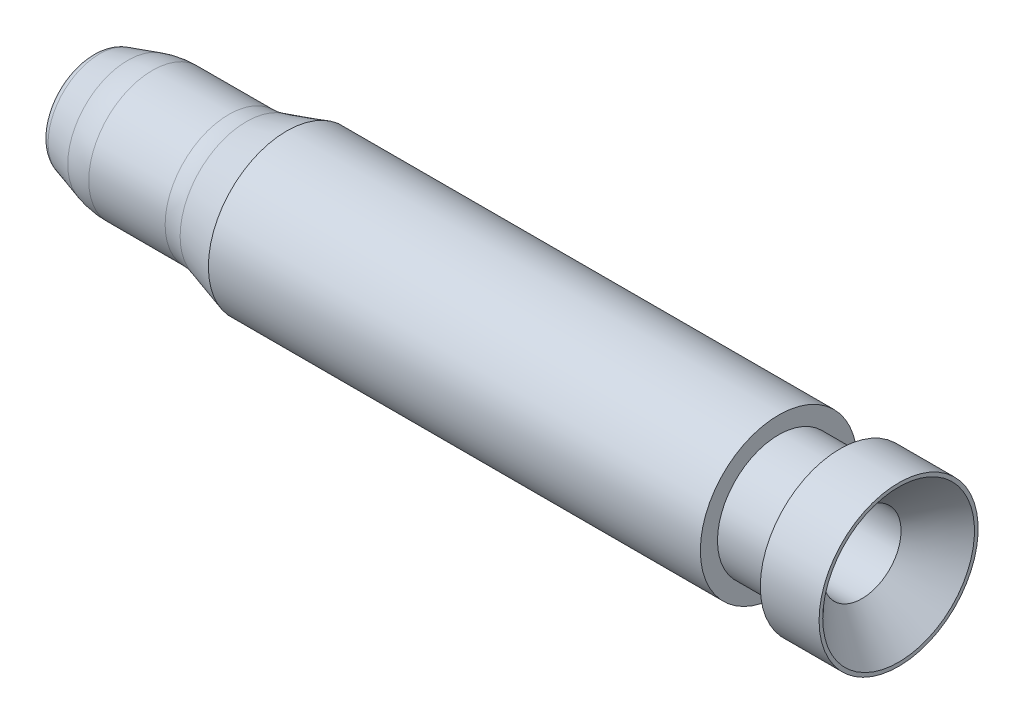
ISO-10303-21;
HEADER;
FILE_DESCRIPTION(('STEP AP214'),'2;1');
FILE_NAME('part.step','',(''),(''),'','','');
FILE_SCHEMA(('AUTOMOTIVE_DESIGN { 1 0 10303 214 1 1 1 1 }'));
ENDSEC;
DATA;
#1=APPLICATION_CONTEXT('core data for automotive mechanical design processes');
#2=APPLICATION_PROTOCOL_DEFINITION('international standard','automotive_design',2000,#1);
#3=PRODUCT_CONTEXT('',#1,'mechanical');
#4=PRODUCT('Part','Part','',(#3));
#5=PRODUCT_RELATED_PRODUCT_CATEGORY('part','',(#4));
#6=PRODUCT_DEFINITION_FORMATION('','',#4);
#7=PRODUCT_DEFINITION_CONTEXT('part definition',#1,'design');
#8=PRODUCT_DEFINITION('design','',#6,#7);
#9=PRODUCT_DEFINITION_SHAPE('','',#8);
#10=(LENGTH_UNIT() NAMED_UNIT(*) SI_UNIT(.MILLI.,.METRE.));
#11=(NAMED_UNIT(*) PLANE_ANGLE_UNIT() SI_UNIT($,.RADIAN.));
#12=(NAMED_UNIT(*) SI_UNIT($,.STERADIAN.) SOLID_ANGLE_UNIT());
#13=UNCERTAINTY_MEASURE_WITH_UNIT(LENGTH_MEASURE(1.E-05),#10,'distance_accuracy_value','');
#14=(GEOMETRIC_REPRESENTATION_CONTEXT(3) GLOBAL_UNCERTAINTY_ASSIGNED_CONTEXT((#13)) GLOBAL_UNIT_ASSIGNED_CONTEXT((#10,
#11,#12)) REPRESENTATION_CONTEXT('',''));
#15=CARTESIAN_POINT('',(0.,0.,0.));
#16=DIRECTION('',(0.,0.,1.));
#17=DIRECTION('',(1.,0.,0.));
#18=AXIS2_PLACEMENT_3D('',#15,#16,#17);
#19=CARTESIAN_POINT('',(0.000828852142926995,0.,-3.19999999999999));
#20=DIRECTION('',(1.,0.,0.));
#21=DIRECTION('',(0.,0.,-1.));
#22=AXIS2_PLACEMENT_3D('',#19,#20,#21);
#23=PLANE('',#22);
#24=CARTESIAN_POINT('',(0.000828852142926995,0.,0.));
#25=DIRECTION('',(1.,0.,0.));
#26=DIRECTION('',(0.,0.,-1.));
#27=AXIS2_PLACEMENT_3D('',#24,#25,#26);
#28=CIRCLE('',#27,3.25596934910894);
#29=CARTESIAN_POINT('',(0.000828852142926994,0.,-3.25596934910894));
#30=VERTEX_POINT('',#29);
#31=EDGE_CURVE('E53',#30,#30,#28,.F.);
#32=ORIENTED_EDGE('',*,*,#31,.T.);
#33=EDGE_LOOP('',(#32));
#34=FACE_BOUND('',#33,.T.);
#35=CARTESIAN_POINT('',(0.000828852142926995,0.,0.));
#36=DIRECTION('',(-1.,0.,0.));
#37=DIRECTION('',(0.,0.,1.));
#38=AXIS2_PLACEMENT_3D('',#35,#36,#37);
#39=CIRCLE('',#38,3.19999999999999);
#40=CARTESIAN_POINT('',(0.000828852142926995,0.,3.19999999999999));
#41=VERTEX_POINT('',#40);
#42=EDGE_CURVE('E78',#41,#41,#39,.T.);
#43=ORIENTED_EDGE('',*,*,#42,.F.);
#44=EDGE_LOOP('',(#43));
#45=FACE_BOUND('',#44,.T.);
#46=ADVANCED_FACE('F46',(#34,#45),#23,.F.);
#47=CARTESIAN_POINT('',(0.,0.,0.));
#48=DIRECTION('',(-1.,0.,0.));
#49=DIRECTION('',(0.,0.,1.));
#50=AXIS2_PLACEMENT_3D('',#47,#48,#49);
#51=CYLINDRICAL_SURFACE('',#50,3.19999999999999);
#52=CARTESIAN_POINT('',(63.,0.,0.));
#53=DIRECTION('',(-1.,0.,0.));
#54=DIRECTION('',(0.,0.,1.));
#55=AXIS2_PLACEMENT_3D('',#52,#53,#54);
#56=CIRCLE('',#55,3.19999999999999);
#57=CARTESIAN_POINT('',(63.,0.,3.19999999999999));
#58=VERTEX_POINT('',#57);
#59=EDGE_CURVE('E57',#58,#58,#56,.F.);
#60=ORIENTED_EDGE('',*,*,#59,.T.);
#61=EDGE_LOOP('',(#60));
#62=FACE_BOUND('',#61,.T.);
#63=ORIENTED_EDGE('',*,*,#42,.T.);
#64=EDGE_LOOP('',(#63));
#65=FACE_BOUND('',#64,.T.);
#66=ADVANCED_FACE('F134',(#62,#65),#51,.F.);
#67=CARTESIAN_POINT('',(66.,0.,-3.19999999999999));
#68=DIRECTION('',(-1.,0.,0.));
#69=DIRECTION('',(0.,0.,1.));
#70=AXIS2_PLACEMENT_3D('',#67,#68,#69);
#71=PLANE('',#70);
#72=CARTESIAN_POINT('',(66.,0.,0.));
#73=DIRECTION('',(-1.,0.,0.));
#74=DIRECTION('',(0.,0.,1.));
#75=AXIS2_PLACEMENT_3D('',#72,#73,#74);
#76=CIRCLE('',#75,6.19999999999999);
#77=CARTESIAN_POINT('',(66.,0.,6.19999999999999));
#78=VERTEX_POINT('',#77);
#79=EDGE_CURVE('E61',#78,#78,#76,.T.);
#80=ORIENTED_EDGE('',*,*,#79,.T.);
#81=EDGE_LOOP('',(#80));
#82=FACE_BOUND('',#81,.T.);
#83=CARTESIAN_POINT('',(66.,0.,0.));
#84=DIRECTION('',(-1.,0.,0.));
#85=DIRECTION('',(0.,0.,1.));
#86=AXIS2_PLACEMENT_3D('',#83,#84,#85);
#87=CIRCLE('',#86,6.49999999999999);
#88=CARTESIAN_POINT('',(66.,0.,6.49999999999999));
#89=VERTEX_POINT('',#88);
#90=EDGE_CURVE('E81',#89,#89,#87,.T.);
#91=ORIENTED_EDGE('',*,*,#90,.F.);
#92=EDGE_LOOP('',(#91));
#93=FACE_BOUND('',#92,.T.);
#94=ADVANCED_FACE('F129',(#82,#93),#71,.F.);
#95=CARTESIAN_POINT('',(0.,0.,0.));
#96=DIRECTION('',(-1.,0.,0.));
#97=DIRECTION('',(0.,0.,1.));
#98=AXIS2_PLACEMENT_3D('',#95,#96,#97);
#99=CYLINDRICAL_SURFACE('',#98,6.49999999999999);
#100=CARTESIAN_POINT('',(61.2,0.,0.));
#101=DIRECTION('',(-1.,0.,0.));
#102=DIRECTION('',(0.,0.,1.));
#103=AXIS2_PLACEMENT_3D('',#100,#101,#102);
#104=CIRCLE('',#103,6.49999999999999);
#105=CARTESIAN_POINT('',(61.2,0.,6.49999999999999));
#106=VERTEX_POINT('',#105);
#107=EDGE_CURVE('E84',#106,#106,#104,.T.);
#108=ORIENTED_EDGE('',*,*,#107,.F.);
#109=EDGE_LOOP('',(#108));
#110=FACE_BOUND('',#109,.T.);
#111=ORIENTED_EDGE('',*,*,#90,.T.);
#112=EDGE_LOOP('',(#111));
#113=FACE_BOUND('',#112,.T.);
#114=ADVANCED_FACE('F123',(#110,#113),#99,.T.);
#115=CARTESIAN_POINT('',(61.2,0.,-6.49999999999998));
#116=DIRECTION('',(1.,0.,0.));
#117=DIRECTION('',(0.,0.,-1.));
#118=AXIS2_PLACEMENT_3D('',#115,#116,#117);
#119=PLANE('',#118);
#120=CARTESIAN_POINT('',(61.2,0.,0.));
#121=DIRECTION('',(-1.,0.,0.));
#122=DIRECTION('',(0.,0.,1.));
#123=AXIS2_PLACEMENT_3D('',#120,#121,#122);
#124=CIRCLE('',#123,5.);
#125=CARTESIAN_POINT('',(61.2,0.,5.));
#126=VERTEX_POINT('',#125);
#127=EDGE_CURVE('E87',#126,#126,#124,.T.);
#128=ORIENTED_EDGE('',*,*,#127,.F.);
#129=EDGE_LOOP('',(#128));
#130=FACE_BOUND('',#129,.T.);
#131=ORIENTED_EDGE('',*,*,#107,.T.);
#132=EDGE_LOOP('',(#131));
#133=FACE_BOUND('',#132,.T.);
#134=ADVANCED_FACE('F117',(#130,#133),#119,.F.);
#135=CARTESIAN_POINT('',(0.,0.,0.));
#136=DIRECTION('',(-1.,0.,0.));
#137=DIRECTION('',(0.,0.,1.));
#138=AXIS2_PLACEMENT_3D('',#135,#136,#137);
#139=CYLINDRICAL_SURFACE('',#138,5.);
#140=CARTESIAN_POINT('',(56.2,0.,0.));
#141=DIRECTION('',(-1.,0.,0.));
#142=DIRECTION('',(0.,0.,1.));
#143=AXIS2_PLACEMENT_3D('',#140,#141,#142);
#144=CIRCLE('',#143,5.);
#145=CARTESIAN_POINT('',(56.2,0.,5.));
#146=VERTEX_POINT('',#145);
#147=EDGE_CURVE('E90',#146,#146,#144,.T.);
#148=ORIENTED_EDGE('',*,*,#147,.F.);
#149=EDGE_LOOP('',(#148));
#150=FACE_BOUND('',#149,.T.);
#151=ORIENTED_EDGE('',*,*,#127,.T.);
#152=EDGE_LOOP('',(#151));
#153=FACE_BOUND('',#152,.T.);
#154=ADVANCED_FACE('F111',(#150,#153),#139,.T.);
#155=CARTESIAN_POINT('',(56.2,0.,-5.));
#156=DIRECTION('',(-1.,0.,0.));
#157=DIRECTION('',(0.,0.,1.));
#158=AXIS2_PLACEMENT_3D('',#155,#156,#157);
#159=PLANE('',#158);
#160=CARTESIAN_POINT('',(56.2,0.,0.));
#161=DIRECTION('',(-1.,0.,0.));
#162=DIRECTION('',(0.,0.,1.));
#163=AXIS2_PLACEMENT_3D('',#160,#161,#162);
#164=CIRCLE('',#163,6.4);
#165=CARTESIAN_POINT('',(56.2,0.,6.4));
#166=VERTEX_POINT('',#165);
#167=EDGE_CURVE('E93',#166,#166,#164,.T.);
#168=ORIENTED_EDGE('',*,*,#167,.F.);
#169=EDGE_LOOP('',(#168));
#170=FACE_BOUND('',#169,.T.);
#171=ORIENTED_EDGE('',*,*,#147,.T.);
#172=EDGE_LOOP('',(#171));
#173=FACE_BOUND('',#172,.T.);
#174=ADVANCED_FACE('F105',(#170,#173),#159,.F.);
#175=CARTESIAN_POINT('',(0.,0.,0.));
#176=DIRECTION('',(-1.,0.,0.));
#177=DIRECTION('',(0.,0.,1.));
#178=AXIS2_PLACEMENT_3D('',#175,#176,#177);
#179=CYLINDRICAL_SURFACE('',#178,6.4);
#180=CARTESIAN_POINT('',(16.0008288521429,0.,0.));
#181=DIRECTION('',(-1.,0.,0.));
#182=DIRECTION('',(0.,0.,1.));
#183=AXIS2_PLACEMENT_3D('',#180,#181,#182);
#184=CIRCLE('',#183,6.4);
#185=CARTESIAN_POINT('',(16.0008288521429,0.,6.4));
#186=VERTEX_POINT('',#185);
#187=EDGE_CURVE('E96',#186,#186,#184,.T.);
#188=ORIENTED_EDGE('',*,*,#187,.F.);
#189=EDGE_LOOP('',(#188));
#190=FACE_BOUND('',#189,.T.);
#191=ORIENTED_EDGE('',*,*,#167,.T.);
#192=EDGE_LOOP('',(#191));
#193=FACE_BOUND('',#192,.T.);
#194=ADVANCED_FACE('F102',(#190,#193),#179,.T.);
#195=CARTESIAN_POINT('',(16.0008288521429,0.,0.));
#196=DIRECTION('',(1.,0.,0.));
#197=DIRECTION('',(0.,0.,-1.));
#198=AXIS2_PLACEMENT_3D('',#195,#196,#197);
#199=CONICAL_SURFACE('',#198,6.4,0.291456794477866);
#200=CARTESIAN_POINT('',(12.7037240984571,0.,0.));
#201=DIRECTION('',(1.,0.,0.));
#202=DIRECTION('',(0.,0.,-1.));
#203=AXIS2_PLACEMENT_3D('',#200,#201,#202);
#204=CIRCLE('',#203,5.41086857389424);
#205=CARTESIAN_POINT('',(12.7037240984571,0.,-5.41086857389424));
#206=VERTEX_POINT('',#205);
#207=EDGE_CURVE('E66',#206,#206,#204,.T.);
#208=ORIENTED_EDGE('',*,*,#207,.T.);
#209=EDGE_LOOP('',(#208));
#210=FACE_BOUND('',#209,.T.);
#211=ORIENTED_EDGE('',*,*,#187,.T.);
#212=EDGE_LOOP('',(#211));
#213=FACE_BOUND('',#212,.T.);
#214=ADVANCED_FACE('F100',(#210,#213),#199,.T.);
#215=CARTESIAN_POINT('',(0.,0.,0.));
#216=DIRECTION('',(-1.,0.,0.));
#217=DIRECTION('',(0.,0.,1.));
#218=AXIS2_PLACEMENT_3D('',#215,#216,#217);
#219=CYLINDRICAL_SURFACE('',#218,5.2);
#220=CARTESIAN_POINT('',(11.2669846706253,0.,0.));
#221=DIRECTION('',(-1.,0.,0.));
#222=DIRECTION('',(0.,0.,1.));
#223=AXIS2_PLACEMENT_3D('',#220,#221,#222);
#224=CIRCLE('',#223,5.2);
#225=CARTESIAN_POINT('',(11.2669846706253,0.,5.2));
#226=VERTEX_POINT('',#225);
#227=EDGE_CURVE('E69',#226,#226,#224,.T.);
#228=ORIENTED_EDGE('',*,*,#227,.T.);
#229=EDGE_LOOP('',(#228));
#230=FACE_BOUND('',#229,.T.);
#231=CARTESIAN_POINT('',(5.02821070626755,0.,0.));
#232=DIRECTION('',(1.,0.,0.));
#233=DIRECTION('',(0.,0.,-1.));
#234=AXIS2_PLACEMENT_3D('',#231,#232,#233);
#235=CIRCLE('',#234,5.2);
#236=CARTESIAN_POINT('',(5.02821070626755,0.,-5.2));
#237=VERTEX_POINT('',#236);
#238=EDGE_CURVE('E72',#237,#237,#235,.T.);
#239=ORIENTED_EDGE('',*,*,#238,.T.);
#240=EDGE_LOOP('',(#239));
#241=FACE_BOUND('',#240,.T.);
#242=ADVANCED_FACE('F188',(#230,#241),#219,.T.);
#243=CARTESIAN_POINT('',(4.00082885214292,0.,0.));
#244=DIRECTION('',(1.,0.,0.));
#245=DIRECTION('',(0.,0.,-1.));
#246=AXIS2_PLACEMENT_3D('',#243,#244,#245);
#247=CONICAL_SURFACE('',#246,5.2,0.291456794477867);
#248=CARTESIAN_POINT('',(0.713480966576585,0.,0.));
#249=DIRECTION('',(-1.,0.,0.));
#250=DIRECTION('',(0.,0.,1.));
#251=AXIS2_PLACEMENT_3D('',#248,#249,#250);
#252=CIRCLE('',#251,4.2137956343301);
#253=CARTESIAN_POINT('',(0.713480966576585,0.,4.2137956343301));
#254=VERTEX_POINT('',#253);
#255=EDGE_CURVE('E12',#254,#254,#252,.F.);
#256=ORIENTED_EDGE('',*,*,#255,.T.);
#257=EDGE_LOOP('',(#256));
#258=FACE_BOUND('',#257,.T.);
#259=CARTESIAN_POINT('',(3.01677550730314,0.,0.));
#260=DIRECTION('',(-1.,0.,0.));
#261=DIRECTION('',(0.,0.,1.));
#262=AXIS2_PLACEMENT_3D('',#259,#260,#261);
#263=CIRCLE('',#262,4.90478399654806);
#264=CARTESIAN_POINT('',(3.01677550730314,0.,4.90478399654806));
#265=VERTEX_POINT('',#264);
#266=EDGE_CURVE('E75',#265,#265,#263,.T.);
#267=ORIENTED_EDGE('',*,*,#266,.T.);
#268=EDGE_LOOP('',(#267));
#269=FACE_BOUND('',#268,.T.);
#270=ADVANCED_FACE('F152',(#258,#269),#247,.T.);
#271=CARTESIAN_POINT('',(5.02821070626755,0.,0.));
#272=DIRECTION('',(1.,0.,0.));
#273=DIRECTION('',(0.,0.,-1.));
#274=AXIS2_PLACEMENT_3D('',#271,#272,#273);
#275=DEGENERATE_TOROIDAL_SURFACE('',#274,1.8,7.,.F.);
#276=ORIENTED_EDGE('',*,*,#238,.F.);
#277=EDGE_LOOP('',(#276));
#278=FACE_BOUND('',#277,.T.);
#279=ORIENTED_EDGE('',*,*,#266,.F.);
#280=EDGE_LOOP('',(#279));
#281=FACE_BOUND('',#280,.T.);
#282=ADVANCED_FACE('F148',(#278,#281),#275,.F.);
#283=CARTESIAN_POINT('',(11.2669846706253,0.,0.));
#284=DIRECTION('',(-1.,0.,0.));
#285=DIRECTION('',(0.,0.,1.));
#286=AXIS2_PLACEMENT_3D('',#283,#284,#285);
#287=TOROIDAL_SURFACE('',#286,10.2,5.);
#288=ORIENTED_EDGE('',*,*,#207,.F.);
#289=EDGE_LOOP('',(#288));
#290=FACE_BOUND('',#289,.T.);
#291=ORIENTED_EDGE('',*,*,#227,.F.);
#292=EDGE_LOOP('',(#291));
#293=FACE_BOUND('',#292,.T.);
#294=ADVANCED_FACE('F151',(#290,#293),#287,.F.);
#295=CARTESIAN_POINT('',(66.,0.,0.));
#296=DIRECTION('',(1.,0.,0.));
#297=DIRECTION('',(0.,0.,-1.));
#298=AXIS2_PLACEMENT_3D('',#295,#296,#297);
#299=CONICAL_SURFACE('',#298,6.19999999999999,0.785398163397445);
#300=ORIENTED_EDGE('',*,*,#59,.F.);
#301=EDGE_LOOP('',(#300));
#302=FACE_BOUND('',#301,.T.);
#303=ORIENTED_EDGE('',*,*,#79,.F.);
#304=EDGE_LOOP('',(#303));
#305=FACE_BOUND('',#304,.T.);
#306=ADVANCED_FACE('F155',(#302,#305),#299,.F.);
#307=CARTESIAN_POINT('',(1.00082885214293,0.,0.));
#308=DIRECTION('',(1.,0.,0.));
#309=DIRECTION('',(0.,0.,-1.));
#310=AXIS2_PLACEMENT_3D('',#307,#308,#309);
#311=TOROIDAL_SURFACE('',#310,3.25596934910894,1.);
#312=ORIENTED_EDGE('',*,*,#255,.F.);
#313=EDGE_LOOP('',(#312));
#314=FACE_BOUND('',#313,.T.);
#315=ORIENTED_EDGE('',*,*,#31,.F.);
#316=EDGE_LOOP('',(#315));
#317=FACE_BOUND('',#316,.T.);
#318=ADVANCED_FACE('F48',(#314,#317),#311,.T.);
#319=CLOSED_SHELL('',(#46,#66,#94,#114,#134,#154,#174,#194,#214,#242,#270,#282,#294,#306,#318));
#320=MANIFOLD_SOLID_BREP('B2',#319);
#321=ADVANCED_BREP_SHAPE_REPRESENTATION('',(#18,#320),#14);
#322=SHAPE_DEFINITION_REPRESENTATION(#9,#321);
ENDSEC;
END-ISO-10303-21;
